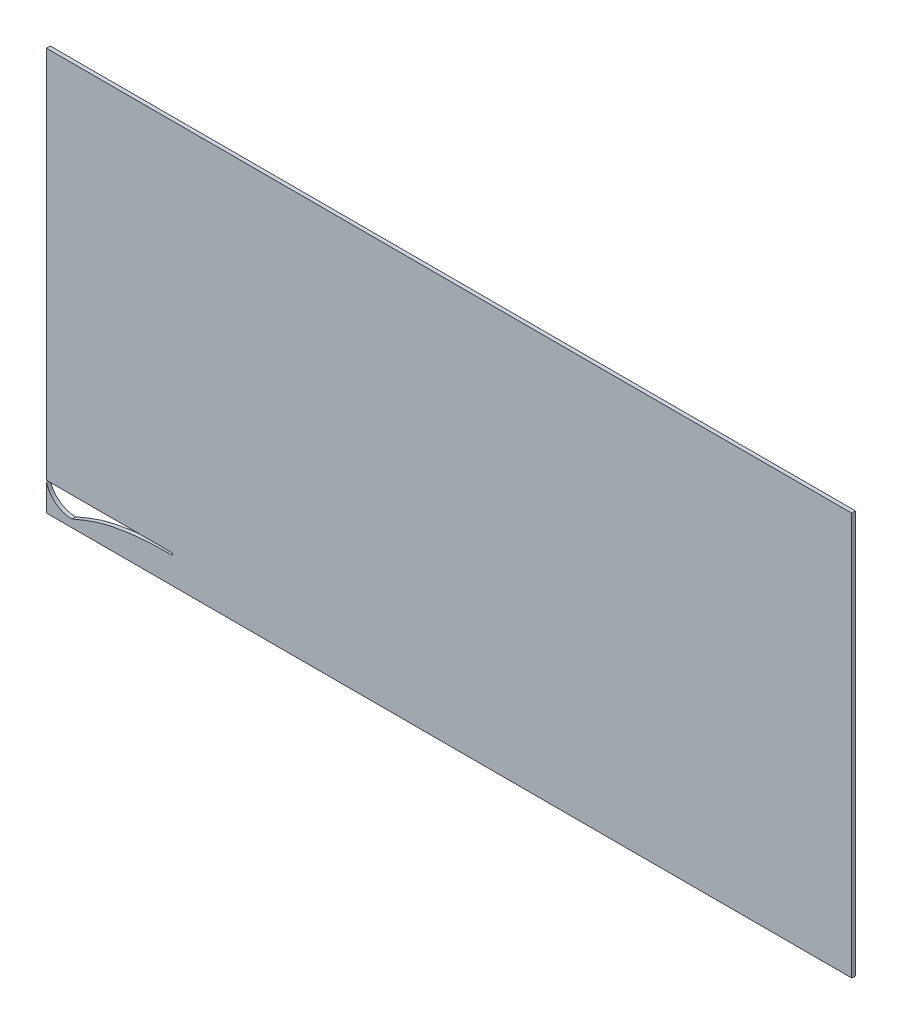
ISO-10303-21;
HEADER;
FILE_DESCRIPTION(('STEP AP214'),'2;1');
FILE_NAME('part.step','',(''),(''),'','','');
FILE_SCHEMA(('AUTOMOTIVE_DESIGN { 1 0 10303 214 1 1 1 1 }'));
ENDSEC;
DATA;
#1=APPLICATION_CONTEXT('core data for automotive mechanical design processes');
#2=APPLICATION_PROTOCOL_DEFINITION('international standard','automotive_design',2000,#1);
#3=PRODUCT_CONTEXT('',#1,'mechanical');
#4=PRODUCT('Part','Part','',(#3));
#5=PRODUCT_RELATED_PRODUCT_CATEGORY('part','',(#4));
#6=PRODUCT_DEFINITION_FORMATION('','',#4);
#7=PRODUCT_DEFINITION_CONTEXT('part definition',#1,'design');
#8=PRODUCT_DEFINITION('design','',#6,#7);
#9=PRODUCT_DEFINITION_SHAPE('','',#8);
#10=(LENGTH_UNIT() NAMED_UNIT(*) SI_UNIT(.MILLI.,.METRE.));
#11=(NAMED_UNIT(*) PLANE_ANGLE_UNIT() SI_UNIT($,.RADIAN.));
#12=(NAMED_UNIT(*) SI_UNIT($,.STERADIAN.) SOLID_ANGLE_UNIT());
#13=UNCERTAINTY_MEASURE_WITH_UNIT(LENGTH_MEASURE(1.E-05),#10,'distance_accuracy_value','');
#14=(GEOMETRIC_REPRESENTATION_CONTEXT(3) GLOBAL_UNCERTAINTY_ASSIGNED_CONTEXT((#13)) GLOBAL_UNIT_ASSIGNED_CONTEXT((#10,
#11,#12)) REPRESENTATION_CONTEXT('',''));
#15=CARTESIAN_POINT('',(0.,0.,0.));
#16=DIRECTION('',(0.,0.,1.));
#17=DIRECTION('',(1.,0.,0.));
#18=AXIS2_PLACEMENT_3D('',#15,#16,#17);
#19=CARTESIAN_POINT('',(13271.8436296076,3499.17830437298,500.));
#20=CARTESIAN_POINT('',(13086.9250048098,3498.66499884008,500.));
#21=CARTESIAN_POINT('',(12724.9111254861,3497.66010424144,500.));
#22=CARTESIAN_POINT('',(12193.2785469383,3489.65042008428,500.));
#23=CARTESIAN_POINT('',(11684.0417999899,3477.35842309258,500.));
#24=CARTESIAN_POINT('',(11196.1130698957,3460.73998610221,500.));
#25=CARTESIAN_POINT('',(10728.4608486626,3440.27310408665,500.));
#26=CARTESIAN_POINT('',(10280.1064550013,3416.26926744557,500.));
#27=CARTESIAN_POINT('',(9850.12081646647,3389.04900635661,500.));
#28=CARTESIAN_POINT('',(9437.62142001631,3358.90003555647,500.));
#29=CARTESIAN_POINT('',(9041.76943364992,3326.08988638772,500.));
#30=CARTESIAN_POINT('',(8661.76697811944,3290.8646536414,500.));
#31=CARTESIAN_POINT('',(8296.85453395597,3253.45107522581,500.));
#32=CARTESIAN_POINT('',(7946.30846742318,3214.05761783001,500.));
#33=CARTESIAN_POINT('',(7609.43865895821,3172.87566636282,500.));
#34=CARTESIAN_POINT('',(7285.58621670322,3130.08054616511,500.));
#35=CARTESIAN_POINT('',(6974.12125636141,3085.83245029746,500.));
#36=CARTESIAN_POINT('',(6674.44072651336,3040.27725545134,500.));
#37=CARTESIAN_POINT('',(6385.96625551308,2993.54722993874,500.));
#38=CARTESIAN_POINT('',(6108.14199180895,2945.76162912806,500.));
#39=CARTESIAN_POINT('',(5840.43240352824,2897.02717188431,500.));
#40=CARTESIAN_POINT('',(5582.31999472627,2847.43838702244,500.));
#41=CARTESIAN_POINT('',(5333.30288379169,2797.07781325235,500.));
#42=CARTESIAN_POINT('',(5092.89217254362,2746.01602835281,500.));
#43=CARTESIAN_POINT('',(4860.60901012999,2694.31147246936,500.));
#44=CARTESIAN_POINT('',(4635.98122012661,2642.01001483501,500.));
#45=CARTESIAN_POINT('',(4418.53930611694,2589.1441902756,500.));
#46=CARTESIAN_POINT('',(4207.81157040473,2535.73199730938,500.));
#47=CARTESIAN_POINT('',(4003.31795526602,2481.77509626198,500.));
#48=CARTESIAN_POINT('',(3804.56201638359,2427.25616094082,500.));
#49=CARTESIAN_POINT('',(3611.02010960045,2372.13499831982,500.));
#50=CARTESIAN_POINT('',(3422.12631282919,2316.34281392824,500.));
#51=CARTESIAN_POINT('',(3237.2506121292,2259.77358269252,500.));
#52=CARTESIAN_POINT('',(3055.66603441382,2202.27070311131,500.));
#53=CARTESIAN_POINT('',(2876.49675834488,2143.6055909797,500.));
#54=CARTESIAN_POINT('',(2698.63152922301,2083.44158203898,500.));
#55=CARTESIAN_POINT('',(2520.56874290567,2021.26917686358,500.));
#56=CARTESIAN_POINT('',(2340.11319595844,1956.27856632947,500.));
#57=CARTESIAN_POINT('',(2153.70073363738,1887.07815454011,500.));
#58=CARTESIAN_POINT('',(1954.57140661001,1810.92642097174,500.));
#59=CARTESIAN_POINT('',(1725.58055855999,1720.77055381008,500.));
#60=CARTESIAN_POINT('',(1362.89735423309,1573.65315108845,500.));
#61=CARTESIAN_POINT('',(781.522297225859,1330.33083885809,500.));
#62=CARTESIAN_POINT('',(291.765900603097,1123.32248873579,500.));
#63=CARTESIAN_POINT('',(0.,1000.,500.));
#64=B_SPLINE_CURVE_WITH_KNOTS('',3,(#19,#20,#21,#22,#23,#24,#25,#26,#27,#28,#29,#30,#31,#32,#33,
#34,#35,#36,#37,#38,#39,#40,#41,#42,#43,#44,#45,#46,#47,#48,#49,#50,#51,#52,#53,#54,#55,#56,#57,
#58,#59,#60,#61,#62,#63),.UNSPECIFIED.,.F.,.F.,(4,1,1,1,1,1,1,1,1,1,1,1,1,1,1,1,1,1,1,1,1,1,1,1,
1,1,1,1,1,1,1,1,1,1,1,1,1,1,1,1,1,1,4),(0.,0.0407219555446966,0.0797210833495334,
0.117084756783115,0.152895538764736,0.187231491670588,0.220166467384935,0.251770379184676,
0.282109457053566,0.311246487948174,0.339241042482563,0.36614968946458,0.392026199706476,
0.416921740550497,0.440885062602319,0.463962680260206,0.486199047777988,0.507636732822636,
0.528316589807407,0.548277935735248,0.567558731927121,0.586195775914367,0.604224909060847,
0.621681247329831,0.638599445304128,0.655014007555113,0.670959667471153,0.686471862929099,
0.701587352849273,0.716345042507938,0.730787125521545,0.744960720265082,0.758920305800569,
0.772731506799802,0.786477276276021,0.80026862594338,0.814264726400486,0.828714552583534,
0.84405629942881,0.861212764179924,0.882908788466279,0.930244458221628,1.),.UNSPECIFIED.);
#65=DIRECTION('',(0.,0.,-1.));
#66=VECTOR('',#65,1.);
#67=SURFACE_OF_LINEAR_EXTRUSION('',#64,#66);
#68=CARTESIAN_POINT('',(13271.8436296076,3499.17830437298,0.));
#69=CARTESIAN_POINT('',(13086.9250048098,3498.66499884008,0.));
#70=CARTESIAN_POINT('',(12724.9111254861,3497.66010424144,0.));
#71=CARTESIAN_POINT('',(12193.2785469383,3489.65042008428,0.));
#72=CARTESIAN_POINT('',(11684.0417999899,3477.35842309258,0.));
#73=CARTESIAN_POINT('',(11196.1130698957,3460.73998610221,0.));
#74=CARTESIAN_POINT('',(10728.4608486626,3440.27310408665,0.));
#75=CARTESIAN_POINT('',(10280.1064550013,3416.26926744557,0.));
#76=CARTESIAN_POINT('',(9850.12081646647,3389.04900635661,0.));
#77=CARTESIAN_POINT('',(9437.62142001631,3358.90003555647,0.));
#78=CARTESIAN_POINT('',(9041.76943364992,3326.08988638772,0.));
#79=CARTESIAN_POINT('',(8661.76697811944,3290.8646536414,0.));
#80=CARTESIAN_POINT('',(8296.85453395597,3253.45107522581,0.));
#81=CARTESIAN_POINT('',(7946.30846742318,3214.05761783001,0.));
#82=CARTESIAN_POINT('',(7609.43865895821,3172.87566636282,0.));
#83=CARTESIAN_POINT('',(7285.58621670322,3130.08054616511,0.));
#84=CARTESIAN_POINT('',(6974.12125636141,3085.83245029746,0.));
#85=CARTESIAN_POINT('',(6674.44072651336,3040.27725545134,0.));
#86=CARTESIAN_POINT('',(6385.96625551308,2993.54722993874,0.));
#87=CARTESIAN_POINT('',(6108.14199180895,2945.76162912806,0.));
#88=CARTESIAN_POINT('',(5840.43240352824,2897.02717188431,0.));
#89=CARTESIAN_POINT('',(5582.31999472627,2847.43838702244,0.));
#90=CARTESIAN_POINT('',(5333.30288379169,2797.07781325235,0.));
#91=CARTESIAN_POINT('',(5092.89217254362,2746.01602835281,0.));
#92=CARTESIAN_POINT('',(4860.60901012999,2694.31147246936,0.));
#93=CARTESIAN_POINT('',(4635.98122012661,2642.01001483501,0.));
#94=CARTESIAN_POINT('',(4418.53930611694,2589.1441902756,0.));
#95=CARTESIAN_POINT('',(4207.81157040473,2535.73199730938,0.));
#96=CARTESIAN_POINT('',(4003.31795526602,2481.77509626198,0.));
#97=CARTESIAN_POINT('',(3804.56201638359,2427.25616094082,0.));
#98=CARTESIAN_POINT('',(3611.02010960045,2372.13499831982,0.));
#99=CARTESIAN_POINT('',(3422.12631282919,2316.34281392824,0.));
#100=CARTESIAN_POINT('',(3237.2506121292,2259.77358269252,0.));
#101=CARTESIAN_POINT('',(3055.66603441382,2202.27070311131,0.));
#102=CARTESIAN_POINT('',(2876.49675834488,2143.6055909797,0.));
#103=CARTESIAN_POINT('',(2698.63152922301,2083.44158203898,0.));
#104=CARTESIAN_POINT('',(2520.56874290567,2021.26917686358,0.));
#105=CARTESIAN_POINT('',(2340.11319595844,1956.27856632947,0.));
#106=CARTESIAN_POINT('',(2153.70073363738,1887.07815454011,0.));
#107=CARTESIAN_POINT('',(1954.57140661001,1810.92642097174,0.));
#108=CARTESIAN_POINT('',(1725.58055855999,1720.77055381008,0.));
#109=CARTESIAN_POINT('',(1362.89735423309,1573.65315108845,0.));
#110=CARTESIAN_POINT('',(781.522297225859,1330.33083885809,0.));
#111=CARTESIAN_POINT('',(291.765900603097,1123.32248873579,0.));
#112=CARTESIAN_POINT('',(0.,1000.,0.));
#113=B_SPLINE_CURVE_WITH_KNOTS('',3,(#68,#69,#70,#71,#72,#73,#74,#75,#76,#77,#78,#79,#80,#81,
#82,#83,#84,#85,#86,#87,#88,#89,#90,#91,#92,#93,#94,#95,#96,#97,#98,#99,#100,#101,#102,#103,
#104,#105,#106,#107,#108,#109,#110,#111,#112),.UNSPECIFIED.,.F.,.F.,(4,1,1,1,1,1,1,1,1,1,1,1,1,
1,1,1,1,1,1,1,1,1,1,1,1,1,1,1,1,1,1,1,1,1,1,1,1,1,1,1,1,1,4),(0.,0.0407219555446966,
0.0797210833495334,0.117084756783115,0.152895538764736,0.187231491670588,0.220166467384935,
0.251770379184676,0.282109457053566,0.311246487948174,0.339241042482563,0.36614968946458,
0.392026199706476,0.416921740550497,0.440885062602319,0.463962680260206,0.486199047777988,
0.507636732822636,0.528316589807407,0.548277935735248,0.567558731927121,0.586195775914367,
0.604224909060847,0.621681247329831,0.638599445304128,0.655014007555113,0.670959667471153,
0.686471862929099,0.701587352849273,0.716345042507938,0.730787125521545,0.744960720265082,
0.758920305800569,0.772731506799802,0.786477276276021,0.80026862594338,0.814264726400486,
0.828714552583534,0.84405629942881,0.861212764179924,0.882908788466279,0.930244458221628,1.),.UNSPECIFIED.);
#114=CARTESIAN_POINT('',(13271.8436296076,3499.17830437298,0.));
#115=VERTEX_POINT('',#114);
#116=CARTESIAN_POINT('',(6.4293956955236E-13,1000.,0.));
#117=VERTEX_POINT('',#116);
#118=EDGE_CURVE('E151',#115,#117,#113,.T.);
#119=ORIENTED_EDGE('',*,*,#118,.T.);
#120=DIRECTION('',(0.,0.,-1.));
#121=VECTOR('',#120,1.);
#122=CARTESIAN_POINT('',(6.4293956955236E-13,1000.,500.));
#123=LINE('',#122,#121);
#124=CARTESIAN_POINT('',(6.4293956955236E-13,1000.,500.));
#125=VERTEX_POINT('',#124);
#126=EDGE_CURVE('E11',#125,#117,#123,.T.);
#127=ORIENTED_EDGE('',*,*,#126,.F.);
#128=CARTESIAN_POINT('',(13271.8436296076,3499.17830437298,500.));
#129=VERTEX_POINT('',#128);
#130=EDGE_CURVE('E181',#129,#125,#64,.T.);
#131=ORIENTED_EDGE('',*,*,#130,.F.);
#132=DIRECTION('',(0.,0.,-1.));
#133=VECTOR('',#132,1.);
#134=CARTESIAN_POINT('',(13271.8436296076,3499.17830437298,500.));
#135=LINE('',#134,#133);
#136=EDGE_CURVE('E147',#129,#115,#135,.T.);
#137=ORIENTED_EDGE('',*,*,#136,.T.);
#138=EDGE_LOOP('',(#119,#127,#131,#137));
#139=FACE_BOUND('',#138,.T.);
#140=ADVANCED_FACE('F43',(#139),#67,.F.);
#141=CARTESIAN_POINT('',(0.,4500.,500.));
#142=DIRECTION('',(0.,0.,-1.));
#143=DIRECTION('',(-1.,0.,0.));
#144=AXIS2_PLACEMENT_3D('',#141,#142,#143);
#145=CYLINDRICAL_SURFACE('',#144,3500.);
#146=CARTESIAN_POINT('',(0.,4500.,0.));
#147=DIRECTION('',(0.,0.,-1.));
#148=DIRECTION('',(-1.,0.,0.));
#149=AXIS2_PLACEMENT_3D('',#146,#147,#148);
#150=CIRCLE('',#149,3500.);
#151=CARTESIAN_POINT('',(-3353.85687434068,3499.17830437298,0.));
#152=VERTEX_POINT('',#151);
#153=EDGE_CURVE('E157',#117,#152,#150,.T.);
#154=ORIENTED_EDGE('',*,*,#153,.T.);
#155=DIRECTION('',(0.,0.,-1.));
#156=VECTOR('',#155,1.);
#157=CARTESIAN_POINT('',(-3353.85687434068,3499.17830437298,500.));
#158=LINE('',#157,#156);
#159=CARTESIAN_POINT('',(-3353.85687434068,3499.17830437298,500.));
#160=VERTEX_POINT('',#159);
#161=EDGE_CURVE('E53',#160,#152,#158,.T.);
#162=ORIENTED_EDGE('',*,*,#161,.F.);
#163=CARTESIAN_POINT('',(0.,4500.,500.));
#164=DIRECTION('',(0.,0.,-1.));
#165=DIRECTION('',(-1.,0.,0.));
#166=AXIS2_PLACEMENT_3D('',#163,#164,#165);
#167=CIRCLE('',#166,3500.);
#168=EDGE_CURVE('E107',#125,#160,#167,.T.);
#169=ORIENTED_EDGE('',*,*,#168,.F.);
#170=ORIENTED_EDGE('',*,*,#126,.T.);
#171=EDGE_LOOP('',(#154,#162,#169,#170));
#172=FACE_BOUND('',#171,.T.);
#173=ADVANCED_FACE('F242',(#172),#145,.F.);
#174=CARTESIAN_POINT('',(-3353.85687434068,3499.17830437298,500.));
#175=DIRECTION('',(1.,0.,0.));
#176=DIRECTION('',(0.,0.,-1.));
#177=AXIS2_PLACEMENT_3D('',#174,#175,#176);
#178=PLANE('',#177);
#179=DIRECTION('',(0.,-1.,0.));
#180=VECTOR('',#179,1.);
#181=CARTESIAN_POINT('',(-3353.85687434068,3499.17830437298,0.));
#182=LINE('',#181,#180);
#183=CARTESIAN_POINT('',(-3353.85687434068,0.,0.));
#184=VERTEX_POINT('',#183);
#185=EDGE_CURVE('E163',#152,#184,#182,.T.);
#186=ORIENTED_EDGE('',*,*,#185,.T.);
#187=DIRECTION('',(0.,0.,-1.));
#188=VECTOR('',#187,1.);
#189=CARTESIAN_POINT('',(-3353.85687434068,0.,500.));
#190=LINE('',#189,#188);
#191=CARTESIAN_POINT('',(-3353.85687434068,0.,500.));
#192=VERTEX_POINT('',#191);
#193=EDGE_CURVE('E196',#192,#184,#190,.T.);
#194=ORIENTED_EDGE('',*,*,#193,.F.);
#195=DIRECTION('',(0.,-1.,0.));
#196=VECTOR('',#195,1.);
#197=CARTESIAN_POINT('',(-3353.85687434068,3499.17830437298,500.));
#198=LINE('',#197,#196);
#199=EDGE_CURVE('E206',#160,#192,#198,.T.);
#200=ORIENTED_EDGE('',*,*,#199,.F.);
#201=ORIENTED_EDGE('',*,*,#161,.T.);
#202=EDGE_LOOP('',(#186,#194,#200,#201));
#203=FACE_BOUND('',#202,.T.);
#204=ADVANCED_FACE('F204',(#203),#178,.F.);
#205=CARTESIAN_POINT('',(-3353.85687434068,0.,500.));
#206=DIRECTION('',(0.,1.,0.));
#207=DIRECTION('',(0.,0.,1.));
#208=AXIS2_PLACEMENT_3D('',#205,#206,#207);
#209=PLANE('',#208);
#210=DIRECTION('',(1.,0.,0.));
#211=VECTOR('',#210,1.);
#212=CARTESIAN_POINT('',(-3353.85687434068,0.,0.));
#213=LINE('',#212,#211);
#214=CARTESIAN_POINT('',(102806.143125659,0.,0.));
#215=VERTEX_POINT('',#214);
#216=EDGE_CURVE('E166',#184,#215,#213,.T.);
#217=ORIENTED_EDGE('',*,*,#216,.T.);
#218=DIRECTION('',(0.,0.,-1.));
#219=VECTOR('',#218,1.);
#220=CARTESIAN_POINT('',(102806.143125659,0.,500.));
#221=LINE('',#220,#219);
#222=CARTESIAN_POINT('',(102806.143125659,0.,500.));
#223=VERTEX_POINT('',#222);
#224=EDGE_CURVE('E192',#223,#215,#221,.T.);
#225=ORIENTED_EDGE('',*,*,#224,.F.);
#226=DIRECTION('',(1.,0.,0.));
#227=VECTOR('',#226,1.);
#228=CARTESIAN_POINT('',(-3353.85687434068,0.,500.));
#229=LINE('',#228,#227);
#230=EDGE_CURVE('E223',#192,#223,#229,.T.);
#231=ORIENTED_EDGE('',*,*,#230,.F.);
#232=ORIENTED_EDGE('',*,*,#193,.T.);
#233=EDGE_LOOP('',(#217,#225,#231,#232));
#234=FACE_BOUND('',#233,.T.);
#235=ADVANCED_FACE('F215',(#234),#209,.F.);
#236=CARTESIAN_POINT('',(102806.143125659,0.,500.));
#237=DIRECTION('',(-1.,0.,0.));
#238=DIRECTION('',(0.,0.,1.));
#239=AXIS2_PLACEMENT_3D('',#236,#237,#238);
#240=PLANE('',#239);
#241=DIRECTION('',(0.,1.,0.));
#242=VECTOR('',#241,1.);
#243=CARTESIAN_POINT('',(102806.143125659,0.,0.));
#244=LINE('',#243,#242);
#245=CARTESIAN_POINT('',(102806.143125659,53080.,0.));
#246=VERTEX_POINT('',#245);
#247=EDGE_CURVE('E169',#215,#246,#244,.T.);
#248=ORIENTED_EDGE('',*,*,#247,.T.);
#249=DIRECTION('',(0.,0.,-1.));
#250=VECTOR('',#249,1.);
#251=CARTESIAN_POINT('',(102806.143125659,53080.,500.));
#252=LINE('',#251,#250);
#253=CARTESIAN_POINT('',(102806.143125659,53080.,500.));
#254=VERTEX_POINT('',#253);
#255=EDGE_CURVE('E188',#254,#246,#252,.T.);
#256=ORIENTED_EDGE('',*,*,#255,.F.);
#257=DIRECTION('',(0.,1.,0.));
#258=VECTOR('',#257,1.);
#259=CARTESIAN_POINT('',(102806.143125659,0.,500.));
#260=LINE('',#259,#258);
#261=EDGE_CURVE('E221',#223,#254,#260,.T.);
#262=ORIENTED_EDGE('',*,*,#261,.F.);
#263=ORIENTED_EDGE('',*,*,#224,.T.);
#264=EDGE_LOOP('',(#248,#256,#262,#263));
#265=FACE_BOUND('',#264,.T.);
#266=ADVANCED_FACE('F219',(#265),#240,.F.);
#267=CARTESIAN_POINT('',(102806.143125659,53080.,500.));
#268=DIRECTION('',(0.,-1.,0.));
#269=DIRECTION('',(1.,0.,0.));
#270=AXIS2_PLACEMENT_3D('',#267,#268,#269);
#271=PLANE('',#270);
#272=DIRECTION('',(-1.,0.,0.));
#273=VECTOR('',#272,1.);
#274=CARTESIAN_POINT('',(102806.143125659,53080.,0.));
#275=LINE('',#274,#273);
#276=CARTESIAN_POINT('',(-3353.85687434069,53080.,0.));
#277=VERTEX_POINT('',#276);
#278=EDGE_CURVE('E172',#246,#277,#275,.T.);
#279=ORIENTED_EDGE('',*,*,#278,.T.);
#280=DIRECTION('',(0.,0.,-1.));
#281=VECTOR('',#280,1.);
#282=CARTESIAN_POINT('',(-3353.85687434069,53080.,500.));
#283=LINE('',#282,#281);
#284=CARTESIAN_POINT('',(-3353.85687434069,53080.,500.));
#285=VERTEX_POINT('',#284);
#286=EDGE_CURVE('E140',#285,#277,#283,.T.);
#287=ORIENTED_EDGE('',*,*,#286,.F.);
#288=DIRECTION('',(-1.,0.,0.));
#289=VECTOR('',#288,1.);
#290=CARTESIAN_POINT('',(102806.143125659,53080.,500.));
#291=LINE('',#290,#289);
#292=EDGE_CURVE('E129',#254,#285,#291,.T.);
#293=ORIENTED_EDGE('',*,*,#292,.F.);
#294=ORIENTED_EDGE('',*,*,#255,.T.);
#295=EDGE_LOOP('',(#279,#287,#293,#294));
#296=FACE_BOUND('',#295,.T.);
#297=ADVANCED_FACE('F254',(#296),#271,.F.);
#298=CARTESIAN_POINT('',(-3353.85687434069,53080.,500.));
#299=DIRECTION('',(1.,0.,0.));
#300=DIRECTION('',(0.,1.,0.));
#301=AXIS2_PLACEMENT_3D('',#298,#299,#300);
#302=PLANE('',#301);
#303=DIRECTION('',(0.,-1.,0.));
#304=VECTOR('',#303,1.);
#305=CARTESIAN_POINT('',(-3353.85687434069,53080.,0.));
#306=LINE('',#305,#304);
#307=CARTESIAN_POINT('',(-3353.85687434068,3749.17830437298,0.));
#308=VERTEX_POINT('',#307);
#309=EDGE_CURVE('E138',#277,#308,#306,.T.);
#310=ORIENTED_EDGE('',*,*,#309,.T.);
#311=DIRECTION('',(0.,0.,-1.));
#312=VECTOR('',#311,1.);
#313=CARTESIAN_POINT('',(-3353.85687434068,3749.17830437298,500.));
#314=LINE('',#313,#312);
#315=CARTESIAN_POINT('',(-3353.85687434068,3749.17830437298,500.));
#316=VERTEX_POINT('',#315);
#317=EDGE_CURVE('E135',#316,#308,#314,.T.);
#318=ORIENTED_EDGE('',*,*,#317,.F.);
#319=DIRECTION('',(0.,-1.,0.));
#320=VECTOR('',#319,1.);
#321=CARTESIAN_POINT('',(-3353.85687434069,53080.,500.));
#322=LINE('',#321,#320);
#323=EDGE_CURVE('E123',#285,#316,#322,.T.);
#324=ORIENTED_EDGE('',*,*,#323,.F.);
#325=ORIENTED_EDGE('',*,*,#286,.T.);
#326=EDGE_LOOP('',(#310,#318,#324,#325));
#327=FACE_BOUND('',#326,.T.);
#328=ADVANCED_FACE('F136',(#327),#302,.F.);
#329=CARTESIAN_POINT('',(-3353.85687434068,3749.17830437298,500.));
#330=DIRECTION('',(0.,1.,0.));
#331=DIRECTION('',(0.,0.,1.));
#332=AXIS2_PLACEMENT_3D('',#329,#330,#331);
#333=PLANE('',#332);
#334=DIRECTION('',(1.,0.,0.));
#335=VECTOR('',#334,1.);
#336=CARTESIAN_POINT('',(-3353.85687434068,3749.17830437298,0.));
#337=LINE('',#336,#335);
#338=CARTESIAN_POINT('',(13271.8436296076,3749.17830437298,0.));
#339=VERTEX_POINT('',#338);
#340=EDGE_CURVE('E93',#308,#339,#337,.T.);
#341=ORIENTED_EDGE('',*,*,#340,.T.);
#342=DIRECTION('',(0.,0.,-1.));
#343=VECTOR('',#342,1.);
#344=CARTESIAN_POINT('',(13271.8436296076,3749.17830437298,500.));
#345=LINE('',#344,#343);
#346=CARTESIAN_POINT('',(13271.8436296076,3749.17830437298,500.));
#347=VERTEX_POINT('',#346);
#348=EDGE_CURVE('E141',#347,#339,#345,.T.);
#349=ORIENTED_EDGE('',*,*,#348,.F.);
#350=DIRECTION('',(1.,0.,0.));
#351=VECTOR('',#350,1.);
#352=CARTESIAN_POINT('',(-3353.85687434068,3749.17830437298,500.));
#353=LINE('',#352,#351);
#354=EDGE_CURVE('E127',#316,#347,#353,.T.);
#355=ORIENTED_EDGE('',*,*,#354,.F.);
#356=ORIENTED_EDGE('',*,*,#317,.T.);
#357=EDGE_LOOP('',(#341,#349,#355,#356));
#358=FACE_BOUND('',#357,.T.);
#359=ADVANCED_FACE('F143',(#358),#333,.F.);
#360=CARTESIAN_POINT('',(13271.8436296076,3749.17830437298,500.));
#361=DIRECTION('',(1.,0.,0.));
#362=DIRECTION('',(0.,0.,-1.));
#363=AXIS2_PLACEMENT_3D('',#360,#361,#362);
#364=PLANE('',#363);
#365=DIRECTION('',(0.,-1.,0.));
#366=VECTOR('',#365,1.);
#367=CARTESIAN_POINT('',(13271.8436296076,3749.17830437298,0.));
#368=LINE('',#367,#366);
#369=EDGE_CURVE('E99',#339,#115,#368,.T.);
#370=ORIENTED_EDGE('',*,*,#369,.T.);
#371=ORIENTED_EDGE('',*,*,#136,.F.);
#372=DIRECTION('',(0.,-1.,0.));
#373=VECTOR('',#372,1.);
#374=CARTESIAN_POINT('',(13271.8436296076,3749.17830437298,500.));
#375=LINE('',#374,#373);
#376=EDGE_CURVE('E61',#347,#129,#375,.T.);
#377=ORIENTED_EDGE('',*,*,#376,.F.);
#378=ORIENTED_EDGE('',*,*,#348,.T.);
#379=EDGE_LOOP('',(#370,#371,#377,#378));
#380=FACE_BOUND('',#379,.T.);
#381=ADVANCED_FACE('F262',(#380),#364,.F.);
#382=CARTESIAN_POINT('',(6485.2915004037,3009.48522350827,500.));
#383=DIRECTION('',(0.,0.,1.));
#384=DIRECTION('',(1.,0.,0.));
#385=AXIS2_PLACEMENT_3D('',#382,#383,#384);
#386=PLANE('',#385);
#387=ORIENTED_EDGE('',*,*,#130,.T.);
#388=ORIENTED_EDGE('',*,*,#168,.T.);
#389=ORIENTED_EDGE('',*,*,#199,.T.);
#390=ORIENTED_EDGE('',*,*,#230,.T.);
#391=ORIENTED_EDGE('',*,*,#261,.T.);
#392=ORIENTED_EDGE('',*,*,#292,.T.);
#393=ORIENTED_EDGE('',*,*,#323,.T.);
#394=ORIENTED_EDGE('',*,*,#354,.T.);
#395=ORIENTED_EDGE('',*,*,#376,.T.);
#396=EDGE_LOOP('',(#387,#388,#389,#390,#391,#392,#393,#394,#395));
#397=FACE_BOUND('',#396,.T.);
#398=ADVANCED_FACE('F125',(#397),#386,.T.);
#399=CARTESIAN_POINT('',(6485.2915004037,3009.48522350827,0.));
#400=DIRECTION('',(0.,0.,1.));
#401=DIRECTION('',(1.,0.,0.));
#402=AXIS2_PLACEMENT_3D('',#399,#400,#401);
#403=PLANE('',#402);
#404=ORIENTED_EDGE('',*,*,#118,.F.);
#405=ORIENTED_EDGE('',*,*,#369,.F.);
#406=ORIENTED_EDGE('',*,*,#340,.F.);
#407=ORIENTED_EDGE('',*,*,#309,.F.);
#408=ORIENTED_EDGE('',*,*,#278,.F.);
#409=ORIENTED_EDGE('',*,*,#247,.F.);
#410=ORIENTED_EDGE('',*,*,#216,.F.);
#411=ORIENTED_EDGE('',*,*,#185,.F.);
#412=ORIENTED_EDGE('',*,*,#153,.F.);
#413=EDGE_LOOP('',(#404,#405,#406,#407,#408,#409,#410,#411,#412));
#414=FACE_BOUND('',#413,.T.);
#415=ADVANCED_FACE('F210',(#414),#403,.F.);
#416=CLOSED_SHELL('',(#140,#173,#204,#235,#266,#297,#328,#359,#381,#398,#415));
#417=MANIFOLD_SOLID_BREP('B2',#416);
#418=ADVANCED_BREP_SHAPE_REPRESENTATION('',(#18,#417),#14);
#419=SHAPE_DEFINITION_REPRESENTATION(#9,#418);
ENDSEC;
END-ISO-10303-21;
